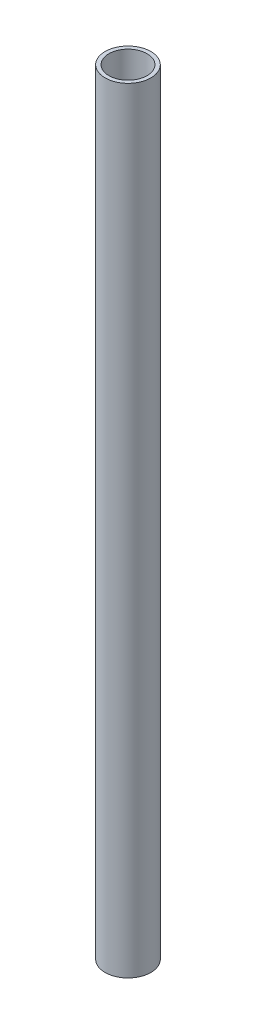
ISO-10303-21;
HEADER;
FILE_DESCRIPTION(('STEP AP214'),'2;1');
FILE_NAME('part.step','',(''),(''),'','','');
FILE_SCHEMA(('AUTOMOTIVE_DESIGN { 1 0 10303 214 1 1 1 1 }'));
ENDSEC;
DATA;
#1=APPLICATION_CONTEXT('core data for automotive mechanical design processes');
#2=APPLICATION_PROTOCOL_DEFINITION('international standard','automotive_design',2000,#1);
#3=PRODUCT_CONTEXT('',#1,'mechanical');
#4=PRODUCT('Part','Part','',(#3));
#5=PRODUCT_RELATED_PRODUCT_CATEGORY('part','',(#4));
#6=PRODUCT_DEFINITION_FORMATION('','',#4);
#7=PRODUCT_DEFINITION_CONTEXT('part definition',#1,'design');
#8=PRODUCT_DEFINITION('design','',#6,#7);
#9=PRODUCT_DEFINITION_SHAPE('','',#8);
#10=(LENGTH_UNIT() NAMED_UNIT(*) SI_UNIT(.MILLI.,.METRE.));
#11=(NAMED_UNIT(*) PLANE_ANGLE_UNIT() SI_UNIT($,.RADIAN.));
#12=(NAMED_UNIT(*) SI_UNIT($,.STERADIAN.) SOLID_ANGLE_UNIT());
#13=UNCERTAINTY_MEASURE_WITH_UNIT(LENGTH_MEASURE(1.E-05),#10,'distance_accuracy_value','');
#14=(GEOMETRIC_REPRESENTATION_CONTEXT(3) GLOBAL_UNCERTAINTY_ASSIGNED_CONTEXT((#13)) GLOBAL_UNIT_ASSIGNED_CONTEXT((#10,
#11,#12)) REPRESENTATION_CONTEXT('',''));
#15=CARTESIAN_POINT('',(0.,0.,0.));
#16=DIRECTION('',(0.,0.,1.));
#17=DIRECTION('',(1.,0.,0.));
#18=AXIS2_PLACEMENT_3D('',#15,#16,#17);
#19=CARTESIAN_POINT('',(0.,203.2,0.));
#20=DIRECTION('',(0.,1.,0.));
#21=DIRECTION('',(0.,0.,1.));
#22=AXIS2_PLACEMENT_3D('',#19,#20,#21);
#23=PLANE('',#22);
#24=CARTESIAN_POINT('',(0.,203.2,0.));
#25=DIRECTION('',(0.,1.,0.));
#26=DIRECTION('',(0.,0.,1.));
#27=AXIS2_PLACEMENT_3D('',#24,#25,#26);
#28=CIRCLE('',#27,6.);
#29=CARTESIAN_POINT('',(0.,203.2,6.));
#30=VERTEX_POINT('',#29);
#31=EDGE_CURVE('E12',#30,#30,#28,.T.);
#32=ORIENTED_EDGE('',*,*,#31,.T.);
#33=EDGE_LOOP('',(#32));
#34=FACE_BOUND('',#33,.T.);
#35=CARTESIAN_POINT('',(0.,203.2,0.));
#36=DIRECTION('',(0.,1.,0.));
#37=DIRECTION('',(0.,0.,1.));
#38=AXIS2_PLACEMENT_3D('',#35,#36,#37);
#39=CIRCLE('',#38,5.);
#40=CARTESIAN_POINT('',(0.,203.2,5.));
#41=VERTEX_POINT('',#40);
#42=EDGE_CURVE('E52',#41,#41,#39,.T.);
#43=ORIENTED_EDGE('',*,*,#42,.F.);
#44=EDGE_LOOP('',(#43));
#45=FACE_BOUND('',#44,.T.);
#46=ADVANCED_FACE('F41',(#34,#45),#23,.T.);
#47=CARTESIAN_POINT('',(0.,0.,0.));
#48=DIRECTION('',(0.,1.,0.));
#49=DIRECTION('',(0.,0.,1.));
#50=AXIS2_PLACEMENT_3D('',#47,#48,#49);
#51=PLANE('',#50);
#52=CARTESIAN_POINT('',(0.,0.,0.));
#53=DIRECTION('',(0.,1.,0.));
#54=DIRECTION('',(0.,0.,1.));
#55=AXIS2_PLACEMENT_3D('',#52,#53,#54);
#56=CIRCLE('',#55,6.);
#57=CARTESIAN_POINT('',(0.,0.,6.));
#58=VERTEX_POINT('',#57);
#59=EDGE_CURVE('E45',#58,#58,#56,.T.);
#60=ORIENTED_EDGE('',*,*,#59,.F.);
#61=EDGE_LOOP('',(#60));
#62=FACE_BOUND('',#61,.T.);
#63=CARTESIAN_POINT('',(0.,0.,0.));
#64=DIRECTION('',(0.,1.,0.));
#65=DIRECTION('',(0.,0.,1.));
#66=AXIS2_PLACEMENT_3D('',#63,#64,#65);
#67=CIRCLE('',#66,5.);
#68=CARTESIAN_POINT('',(0.,0.,5.));
#69=VERTEX_POINT('',#68);
#70=EDGE_CURVE('E54',#69,#69,#67,.T.);
#71=ORIENTED_EDGE('',*,*,#70,.T.);
#72=EDGE_LOOP('',(#71));
#73=FACE_BOUND('',#72,.T.);
#74=ADVANCED_FACE('F64',(#62,#73),#51,.F.);
#75=CARTESIAN_POINT('',(0.,203.2,0.));
#76=DIRECTION('',(0.,-1.,0.));
#77=DIRECTION('',(0.,0.,-1.));
#78=AXIS2_PLACEMENT_3D('',#75,#76,#77);
#79=CYLINDRICAL_SURFACE('',#78,6.);
#80=ORIENTED_EDGE('',*,*,#31,.F.);
#81=EDGE_LOOP('',(#80));
#82=FACE_BOUND('',#81,.T.);
#83=ORIENTED_EDGE('',*,*,#59,.T.);
#84=EDGE_LOOP('',(#83));
#85=FACE_BOUND('',#84,.T.);
#86=ADVANCED_FACE('F43',(#82,#85),#79,.T.);
#87=CARTESIAN_POINT('',(0.,203.2,0.));
#88=DIRECTION('',(0.,-1.,0.));
#89=DIRECTION('',(0.,0.,-1.));
#90=AXIS2_PLACEMENT_3D('',#87,#88,#89);
#91=CYLINDRICAL_SURFACE('',#90,5.);
#92=ORIENTED_EDGE('',*,*,#42,.T.);
#93=EDGE_LOOP('',(#92));
#94=FACE_BOUND('',#93,.T.);
#95=ORIENTED_EDGE('',*,*,#70,.F.);
#96=EDGE_LOOP('',(#95));
#97=FACE_BOUND('',#96,.T.);
#98=ADVANCED_FACE('F60',(#94,#97),#91,.F.);
#99=CLOSED_SHELL('',(#46,#74,#86,#98));
#100=MANIFOLD_SOLID_BREP('B2',#99);
#101=ADVANCED_BREP_SHAPE_REPRESENTATION('',(#18,#100),#14);
#102=SHAPE_DEFINITION_REPRESENTATION(#9,#101);
ENDSEC;
END-ISO-10303-21;
